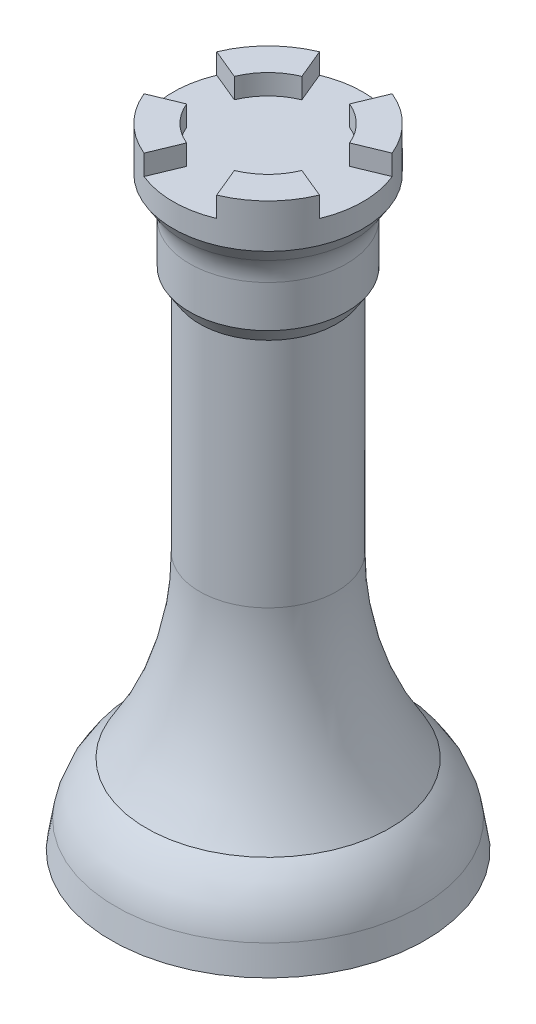
ISO-10303-21;
HEADER;
FILE_DESCRIPTION(('STEP AP214'),'2;1');
FILE_NAME('part.step','',(''),(''),'','','');
FILE_SCHEMA(('AUTOMOTIVE_DESIGN { 1 0 10303 214 1 1 1 1 }'));
ENDSEC;
DATA;
#1=APPLICATION_CONTEXT('core data for automotive mechanical design processes');
#2=APPLICATION_PROTOCOL_DEFINITION('international standard','automotive_design',2000,#1);
#3=PRODUCT_CONTEXT('',#1,'mechanical');
#4=PRODUCT('Part','Part','',(#3));
#5=PRODUCT_RELATED_PRODUCT_CATEGORY('part','',(#4));
#6=PRODUCT_DEFINITION_FORMATION('','',#4);
#7=PRODUCT_DEFINITION_CONTEXT('part definition',#1,'design');
#8=PRODUCT_DEFINITION('design','',#6,#7);
#9=PRODUCT_DEFINITION_SHAPE('','',#8);
#10=(LENGTH_UNIT() NAMED_UNIT(*) SI_UNIT(.MILLI.,.METRE.));
#11=(NAMED_UNIT(*) PLANE_ANGLE_UNIT() SI_UNIT($,.RADIAN.));
#12=(NAMED_UNIT(*) SI_UNIT($,.STERADIAN.) SOLID_ANGLE_UNIT());
#13=UNCERTAINTY_MEASURE_WITH_UNIT(LENGTH_MEASURE(1.E-05),#10,'distance_accuracy_value','');
#14=(GEOMETRIC_REPRESENTATION_CONTEXT(3) GLOBAL_UNCERTAINTY_ASSIGNED_CONTEXT((#13)) GLOBAL_UNIT_ASSIGNED_CONTEXT((#10,
#11,#12)) REPRESENTATION_CONTEXT('',''));
#15=CARTESIAN_POINT('',(0.,0.,0.));
#16=DIRECTION('',(0.,0.,1.));
#17=DIRECTION('',(1.,0.,0.));
#18=AXIS2_PLACEMENT_3D('',#15,#16,#17);
#19=CARTESIAN_POINT('',(4.58968126180055,-9.28491778158869,0.));
#20=DIRECTION('',(0.,-1.,0.));
#21=DIRECTION('',(0.,0.,-1.));
#22=AXIS2_PLACEMENT_3D('',#19,#20,#21);
#23=CYLINDRICAL_SURFACE('',#22,4.60999999999999);
#24=DIRECTION('',(0.,1.,0.));
#25=VECTOR('',#24,1.);
#26=CARTESIAN_POINT('',(2.82551063859744,0.,4.259084644877));
#27=LINE('',#26,#25);
#28=CARTESIAN_POINT('',(2.82551063859744,35.7150822184113,4.259084644877));
#29=VERTEX_POINT('',#28);
#30=CARTESIAN_POINT('',(2.82551063859744,37.2150822184113,4.259084644877));
#31=VERTEX_POINT('',#30);
#32=EDGE_CURVE('E159',#29,#31,#27,.T.);
#33=ORIENTED_EDGE('',*,*,#32,.F.);
#34=CARTESIAN_POINT('',(4.58968126180055,35.7150822184113,0.));
#35=DIRECTION('',(0.,-1.,0.));
#36=DIRECTION('',(0.,0.,-1.));
#37=AXIS2_PLACEMENT_3D('',#34,#35,#36);
#38=CIRCLE('',#37,4.60999999999999);
#39=CARTESIAN_POINT('',(0.330596616923532,35.7150822184113,1.76417062320306));
#40=VERTEX_POINT('',#39);
#41=EDGE_CURVE('E171',#29,#40,#38,.T.);
#42=ORIENTED_EDGE('',*,*,#41,.T.);
#43=DIRECTION('',(0.,1.,0.));
#44=VECTOR('',#43,1.);
#45=CARTESIAN_POINT('',(0.330596616923532,0.,1.76417062320306));
#46=LINE('',#45,#44);
#47=CARTESIAN_POINT('',(0.330596616923532,37.2150822184113,1.76417062320306));
#48=VERTEX_POINT('',#47);
#49=EDGE_CURVE('E256',#40,#48,#46,.T.);
#50=ORIENTED_EDGE('',*,*,#49,.T.);
#51=CARTESIAN_POINT('',(4.58968126180055,37.2150822184113,0.));
#52=DIRECTION('',(0.,-1.,0.));
#53=DIRECTION('',(0.,0.,-1.));
#54=AXIS2_PLACEMENT_3D('',#51,#52,#53);
#55=CIRCLE('',#54,4.60999999999999);
#56=EDGE_CURVE('E173',#31,#48,#55,.T.);
#57=ORIENTED_EDGE('',*,*,#56,.F.);
#58=EDGE_LOOP('',(#33,#42,#50,#57));
#59=FACE_BOUND('',#58,.T.);
#60=ADVANCED_FACE('F42',(#59),#23,.F.);
#61=CARTESIAN_POINT('',(0.,37.2150822184113,0.));
#62=DIRECTION('',(0.,-1.,0.));
#63=DIRECTION('',(0.,0.,-1.));
#64=AXIS2_PLACEMENT_3D('',#61,#62,#63);
#65=PLANE('',#64);
#66=DIRECTION('',(-0.3826834323651,0.,0.923879532511283));
#67=VECTOR('',#66,1.);
#68=CARTESIAN_POINT('',(2.83328628307293,37.2150822184113,4.24031257852809));
#69=LINE('',#68,#67);
#70=CARTESIAN_POINT('',(1.90324356659755,37.2150822184113,6.48563431822919));
#71=VERTEX_POINT('',#70);
#72=EDGE_CURVE('E174',#31,#71,#69,.T.);
#73=ORIENTED_EDGE('',*,*,#72,.F.);
#74=ORIENTED_EDGE('',*,*,#56,.T.);
#75=DIRECTION('',(-0.923879532511287,0.,0.382683432365091));
#76=VECTOR('',#75,1.);
#77=CARTESIAN_POINT('',(0.349368683272445,37.2150822184113,1.75639497872758));
#78=LINE('',#77,#76);
#79=CARTESIAN_POINT('',(-1.89595305642867,37.2150822184113,2.68643769520293));
#80=VERTEX_POINT('',#79);
#81=EDGE_CURVE('E258',#48,#80,#78,.T.);
#82=ORIENTED_EDGE('',*,*,#81,.T.);
#83=CARTESIAN_POINT('',(4.58968126180055,37.2150822184113,0.));
#84=DIRECTION('',(0.,-1.,0.));
#85=DIRECTION('',(0.,0.,-1.));
#86=AXIS2_PLACEMENT_3D('',#83,#84,#85);
#87=CIRCLE('',#86,7.01999999999999);
#88=EDGE_CURVE('E267',#71,#80,#87,.T.);
#89=ORIENTED_EDGE('',*,*,#88,.F.);
#90=EDGE_LOOP('',(#73,#74,#82,#89));
#91=FACE_BOUND('',#90,.T.);
#92=ADVANCED_FACE('F366',(#91),#65,.F.);
#93=CARTESIAN_POINT('',(8.84876590667757,35.7150822184113,1.76417062320306));
#94=VERTEX_POINT('',#93);
#95=CARTESIAN_POINT('',(6.35385188500357,35.7150822184113,4.25908464487704));
#96=VERTEX_POINT('',#95);
#97=EDGE_CURVE('E181',#94,#96,#38,.T.);
#98=ORIENTED_EDGE('',*,*,#97,.T.);
#99=DIRECTION('',(0.,1.,0.));
#100=VECTOR('',#99,1.);
#101=CARTESIAN_POINT('',(6.35385188500357,0.,4.25908464487704));
#102=LINE('',#101,#100);
#103=CARTESIAN_POINT('',(6.35385188500357,37.2150822184113,4.25908464487704));
#104=VERTEX_POINT('',#103);
#105=EDGE_CURVE('E57',#96,#104,#102,.T.);
#106=ORIENTED_EDGE('',*,*,#105,.T.);
#107=CARTESIAN_POINT('',(8.84876590667757,37.2150822184113,1.76417062320306));
#108=VERTEX_POINT('',#107);
#109=EDGE_CURVE('E274',#108,#104,#55,.T.);
#110=ORIENTED_EDGE('',*,*,#109,.F.);
#111=DIRECTION('',(0.,1.,0.));
#112=VECTOR('',#111,1.);
#113=CARTESIAN_POINT('',(8.84876590667757,0.,1.76417062320306));
#114=LINE('',#113,#112);
#115=EDGE_CURVE('E301',#94,#108,#114,.T.);
#116=ORIENTED_EDGE('',*,*,#115,.F.);
#117=EDGE_LOOP('',(#98,#106,#110,#116));
#118=FACE_BOUND('',#117,.T.);
#119=ADVANCED_FACE('F307',(#118),#23,.F.);
#120=ORIENTED_EDGE('',*,*,#109,.T.);
#121=DIRECTION('',(0.382683432365081,0.,0.923879532511291));
#122=VECTOR('',#121,1.);
#123=CARTESIAN_POINT('',(6.34607624052808,37.2150822184113,4.24031257852813));
#124=LINE('',#123,#122);
#125=CARTESIAN_POINT('',(7.27611895700342,37.2150822184113,6.48563431822925));
#126=VERTEX_POINT('',#125);
#127=EDGE_CURVE('E290',#104,#126,#124,.T.);
#128=ORIENTED_EDGE('',*,*,#127,.T.);
#129=CARTESIAN_POINT('',(11.0753155800298,37.2150822184113,2.68643769520293));
#130=VERTEX_POINT('',#129);
#131=EDGE_CURVE('E276',#130,#126,#87,.T.);
#132=ORIENTED_EDGE('',*,*,#131,.F.);
#133=DIRECTION('',(0.923879532511287,0.,0.382683432365091));
#134=VECTOR('',#133,1.);
#135=CARTESIAN_POINT('',(8.82999384032866,37.2150822184113,1.75639497872758));
#136=LINE('',#135,#134);
#137=EDGE_CURVE('E217',#108,#130,#136,.T.);
#138=ORIENTED_EDGE('',*,*,#137,.F.);
#139=EDGE_LOOP('',(#120,#128,#132,#138));
#140=FACE_BOUND('',#139,.T.);
#141=ADVANCED_FACE('F288',(#140),#65,.F.);
#142=CARTESIAN_POINT('',(6.35385188500363,35.7150822184113,-4.25908464487701));
#143=VERTEX_POINT('',#142);
#144=CARTESIAN_POINT('',(8.84876590667757,35.7150822184113,-1.76417062320306));
#145=VERTEX_POINT('',#144);
#146=EDGE_CURVE('E186',#143,#145,#38,.T.);
#147=ORIENTED_EDGE('',*,*,#146,.T.);
#148=DIRECTION('',(0.,1.,0.));
#149=VECTOR('',#148,1.);
#150=CARTESIAN_POINT('',(8.84876590667757,0.,-1.76417062320306));
#151=LINE('',#150,#149);
#152=CARTESIAN_POINT('',(8.84876590667757,37.2150822184113,-1.76417062320306));
#153=VERTEX_POINT('',#152);
#154=EDGE_CURVE('E65',#145,#153,#151,.T.);
#155=ORIENTED_EDGE('',*,*,#154,.T.);
#156=CARTESIAN_POINT('',(6.35385188500363,37.2150822184113,-4.25908464487701));
#157=VERTEX_POINT('',#156);
#158=EDGE_CURVE('E188',#157,#153,#55,.T.);
#159=ORIENTED_EDGE('',*,*,#158,.F.);
#160=DIRECTION('',(0.,1.,0.));
#161=VECTOR('',#160,1.);
#162=CARTESIAN_POINT('',(6.35385188500363,0.,-4.25908464487701));
#163=LINE('',#162,#161);
#164=EDGE_CURVE('E205',#143,#157,#163,.T.);
#165=ORIENTED_EDGE('',*,*,#164,.F.);
#166=EDGE_LOOP('',(#147,#155,#159,#165));
#167=FACE_BOUND('',#166,.T.);
#168=ADVANCED_FACE('F202',(#167),#23,.F.);
#169=ORIENTED_EDGE('',*,*,#158,.T.);
#170=DIRECTION('',(0.923879532511287,0.,-0.382683432365091));
#171=VECTOR('',#170,1.);
#172=CARTESIAN_POINT('',(8.82999384032866,37.2150822184113,-1.75639497872758));
#173=LINE('',#172,#171);
#174=CARTESIAN_POINT('',(11.0753155800298,37.2150822184113,-2.68643769520293));
#175=VERTEX_POINT('',#174);
#176=EDGE_CURVE('E214',#153,#175,#173,.T.);
#177=ORIENTED_EDGE('',*,*,#176,.T.);
#178=CARTESIAN_POINT('',(7.27611895700351,37.2150822184113,-6.48563431822921));
#179=VERTEX_POINT('',#178);
#180=EDGE_CURVE('E270',#179,#175,#87,.T.);
#181=ORIENTED_EDGE('',*,*,#180,.F.);
#182=DIRECTION('',(0.382683432365094,0.,-0.923879532511285));
#183=VECTOR('',#182,1.);
#184=CARTESIAN_POINT('',(6.34607624052814,37.2150822184113,-4.2403125785281));
#185=LINE('',#184,#183);
#186=EDGE_CURVE('E228',#157,#179,#185,.T.);
#187=ORIENTED_EDGE('',*,*,#186,.F.);
#188=EDGE_LOOP('',(#169,#177,#181,#187));
#189=FACE_BOUND('',#188,.T.);
#190=ADVANCED_FACE('F367',(#189),#65,.F.);
#191=CARTESIAN_POINT('',(4.58968126180055,-9.28491778158869,0.));
#192=DIRECTION('',(0.,-1.,0.));
#193=DIRECTION('',(0.,0.,-1.));
#194=AXIS2_PLACEMENT_3D('',#191,#192,#193);
#195=CYLINDRICAL_SURFACE('',#194,7.01999999999999);
#196=CARTESIAN_POINT('',(4.58968126180055,33.9850822184113,0.));
#197=DIRECTION('',(0.,-1.,0.));
#198=DIRECTION('',(0.,0.,-1.));
#199=AXIS2_PLACEMENT_3D('',#196,#197,#198);
#200=CIRCLE('',#199,7.01999999999998);
#201=CARTESIAN_POINT('',(4.58968126180055,33.9850822184113,-7.01999999999998));
#202=VERTEX_POINT('',#201);
#203=EDGE_CURVE('E11',#202,#202,#200,.T.);
#204=ORIENTED_EDGE('',*,*,#203,.F.);
#205=EDGE_LOOP('',(#204));
#206=FACE_BOUND('',#205,.T.);
#207=ORIENTED_EDGE('',*,*,#131,.T.);
#208=DIRECTION('',(0.,-1.,0.));
#209=VECTOR('',#208,1.);
#210=CARTESIAN_POINT('',(7.27611895700342,0.,6.48563431822926));
#211=LINE('',#210,#209);
#212=CARTESIAN_POINT('',(7.27611895700342,35.7150822184113,6.48563431822925));
#213=VERTEX_POINT('',#212);
#214=EDGE_CURVE('E283',#126,#213,#211,.T.);
#215=ORIENTED_EDGE('',*,*,#214,.T.);
#216=CARTESIAN_POINT('',(4.58968126180055,35.7150822184113,0.));
#217=DIRECTION('',(0.,-1.,0.));
#218=DIRECTION('',(-1.,0.,0.));
#219=AXIS2_PLACEMENT_3D('',#216,#217,#218);
#220=CIRCLE('',#219,7.01999999999999);
#221=CARTESIAN_POINT('',(1.90324356659755,35.7150822184113,6.48563431822919));
#222=VERTEX_POINT('',#221);
#223=EDGE_CURVE('E292',#213,#222,#220,.T.);
#224=ORIENTED_EDGE('',*,*,#223,.T.);
#225=DIRECTION('',(0.,-1.,0.));
#226=VECTOR('',#225,1.);
#227=CARTESIAN_POINT('',(1.90324356659755,0.,6.4856343182292));
#228=LINE('',#227,#226);
#229=EDGE_CURVE('E162',#71,#222,#228,.T.);
#230=ORIENTED_EDGE('',*,*,#229,.F.);
#231=ORIENTED_EDGE('',*,*,#88,.T.);
#232=DIRECTION('',(0.,-1.,0.));
#233=VECTOR('',#232,1.);
#234=CARTESIAN_POINT('',(-1.89595305642868,0.,2.68643769520294));
#235=LINE('',#234,#233);
#236=CARTESIAN_POINT('',(-1.89595305642867,35.7150822184113,2.68643769520293));
#237=VERTEX_POINT('',#236);
#238=EDGE_CURVE('E261',#80,#237,#235,.T.);
#239=ORIENTED_EDGE('',*,*,#238,.T.);
#240=CARTESIAN_POINT('',(4.58968126180055,35.7150822184113,0.));
#241=DIRECTION('',(0.,-1.,0.));
#242=DIRECTION('',(0.,0.,-1.));
#243=AXIS2_PLACEMENT_3D('',#240,#241,#242);
#244=CIRCLE('',#243,7.01999999999999);
#245=CARTESIAN_POINT('',(-1.89595305642867,35.7150822184113,-2.68643769520293));
#246=VERTEX_POINT('',#245);
#247=EDGE_CURVE('E264',#237,#246,#244,.T.);
#248=ORIENTED_EDGE('',*,*,#247,.T.);
#249=DIRECTION('',(0.,-1.,0.));
#250=VECTOR('',#249,1.);
#251=CARTESIAN_POINT('',(-1.89595305642868,0.,-2.68643769520294));
#252=LINE('',#251,#250);
#253=CARTESIAN_POINT('',(-1.89595305642867,37.2150822184113,-2.68643769520293));
#254=VERTEX_POINT('',#253);
#255=EDGE_CURVE('E252',#254,#246,#252,.T.);
#256=ORIENTED_EDGE('',*,*,#255,.F.);
#257=CARTESIAN_POINT('',(1.90324356659764,37.2150822184113,-6.48563431822923));
#258=VERTEX_POINT('',#257);
#259=EDGE_CURVE('E268',#254,#258,#87,.T.);
#260=ORIENTED_EDGE('',*,*,#259,.T.);
#261=DIRECTION('',(0.,-1.,0.));
#262=VECTOR('',#261,1.);
#263=CARTESIAN_POINT('',(1.90324356659764,0.,-6.48563431822924));
#264=LINE('',#263,#262);
#265=CARTESIAN_POINT('',(1.90324356659764,35.7150822184113,-6.48563431822923));
#266=VERTEX_POINT('',#265);
#267=EDGE_CURVE('E240',#258,#266,#264,.T.);
#268=ORIENTED_EDGE('',*,*,#267,.T.);
#269=CARTESIAN_POINT('',(4.58968126180055,35.7150822184113,0.));
#270=DIRECTION('',(0.,-1.,0.));
#271=DIRECTION('',(1.,0.,0.));
#272=AXIS2_PLACEMENT_3D('',#269,#270,#271);
#273=CIRCLE('',#272,7.01999999999999);
#274=CARTESIAN_POINT('',(7.27611895700351,35.7150822184113,-6.48563431822921));
#275=VERTEX_POINT('',#274);
#276=EDGE_CURVE('E243',#266,#275,#273,.T.);
#277=ORIENTED_EDGE('',*,*,#276,.T.);
#278=DIRECTION('',(0.,-1.,0.));
#279=VECTOR('',#278,1.);
#280=CARTESIAN_POINT('',(7.27611895700351,0.,-6.48563431822922));
#281=LINE('',#280,#279);
#282=EDGE_CURVE('E230',#179,#275,#281,.T.);
#283=ORIENTED_EDGE('',*,*,#282,.F.);
#284=ORIENTED_EDGE('',*,*,#180,.T.);
#285=DIRECTION('',(0.,-1.,0.));
#286=VECTOR('',#285,1.);
#287=CARTESIAN_POINT('',(11.0753155800298,0.,-2.68643769520294));
#288=LINE('',#287,#286);
#289=CARTESIAN_POINT('',(11.0753155800298,35.7150822184113,-2.68643769520293));
#290=VERTEX_POINT('',#289);
#291=EDGE_CURVE('E223',#175,#290,#288,.T.);
#292=ORIENTED_EDGE('',*,*,#291,.T.);
#293=CARTESIAN_POINT('',(4.58968126180055,35.7150822184113,0.));
#294=DIRECTION('',(0.,-1.,0.));
#295=DIRECTION('',(0.,0.,1.));
#296=AXIS2_PLACEMENT_3D('',#293,#294,#295);
#297=CIRCLE('',#296,7.01999999999999);
#298=CARTESIAN_POINT('',(11.0753155800298,35.7150822184113,2.68643769520293));
#299=VERTEX_POINT('',#298);
#300=EDGE_CURVE('E210',#290,#299,#297,.T.);
#301=ORIENTED_EDGE('',*,*,#300,.T.);
#302=DIRECTION('',(0.,-1.,0.));
#303=VECTOR('',#302,1.);
#304=CARTESIAN_POINT('',(11.0753155800298,0.,2.68643769520294));
#305=LINE('',#304,#303);
#306=EDGE_CURVE('E212',#130,#299,#305,.T.);
#307=ORIENTED_EDGE('',*,*,#306,.F.);
#308=EDGE_LOOP('',(#207,#215,#224,#230,#231,#239,#248,#256,#260,#268,#277,#283,#284,#292,#301,#307));
#309=FACE_BOUND('',#308,.T.);
#310=ADVANCED_FACE('F44',(#206,#309),#195,.T.);
#311=CARTESIAN_POINT('',(4.58968126180055,33.9850822184113,0.));
#312=DIRECTION('',(0.,1.,0.));
#313=DIRECTION('',(0.,0.,1.));
#314=AXIS2_PLACEMENT_3D('',#311,#312,#313);
#315=CONICAL_SURFACE('',#314,7.01999999999998,0.574227335637157);
#316=CARTESIAN_POINT('',(4.58968126180055,32.910378533755,0.));
#317=DIRECTION('',(0.,-1.,0.));
#318=DIRECTION('',(0.,0.,-1.));
#319=AXIS2_PLACEMENT_3D('',#316,#317,#318);
#320=CIRCLE('',#319,6.32472164553591);
#321=CARTESIAN_POINT('',(4.58968126180055,32.910378533755,-6.32472164553591));
#322=VERTEX_POINT('',#321);
#323=EDGE_CURVE('E50',#322,#322,#320,.T.);
#324=ORIENTED_EDGE('',*,*,#323,.F.);
#325=EDGE_LOOP('',(#324));
#326=FACE_BOUND('',#325,.T.);
#327=ORIENTED_EDGE('',*,*,#203,.T.);
#328=EDGE_LOOP('',(#327));
#329=FACE_BOUND('',#328,.T.);
#330=ADVANCED_FACE('F402',(#326,#329),#315,.T.);
#331=CARTESIAN_POINT('',(4.58968126180055,31.1296536652647,0.));
#332=DIRECTION('',(0.,-1.,0.));
#333=DIRECTION('',(0.,0.,-1.));
#334=AXIS2_PLACEMENT_3D('',#331,#332,#333);
#335=TOROIDAL_SURFACE('',#334,9.07721863503418,3.27829540073147);
#336=CARTESIAN_POINT('',(4.58968126180055,31.1296536652647,0.));
#337=DIRECTION('',(0.,-1.,0.));
#338=DIRECTION('',(0.,0.,-1.));
#339=AXIS2_PLACEMENT_3D('',#336,#337,#338);
#340=CIRCLE('',#339,5.79892323430271);
#341=CARTESIAN_POINT('',(4.58968126180055,31.1296536652647,-5.79892323430271));
#342=VERTEX_POINT('',#341);
#343=EDGE_CURVE('E624',#342,#342,#340,.T.);
#344=ORIENTED_EDGE('',*,*,#343,.F.);
#345=EDGE_LOOP('',(#344));
#346=FACE_BOUND('',#345,.T.);
#347=ORIENTED_EDGE('',*,*,#323,.T.);
#348=EDGE_LOOP('',(#347));
#349=FACE_BOUND('',#348,.T.);
#350=ADVANCED_FACE('F399',(#346,#349),#335,.F.);
#351=CARTESIAN_POINT('',(4.58968126180055,-9.28491778158869,0.));
#352=DIRECTION('',(0.,-1.,0.));
#353=DIRECTION('',(0.,0.,-1.));
#354=AXIS2_PLACEMENT_3D('',#351,#352,#353);
#355=CYLINDRICAL_SURFACE('',#354,5.79892323430271);
#356=CARTESIAN_POINT('',(4.58968126180055,28.0477884174672,0.));
#357=DIRECTION('',(0.,-1.,0.));
#358=DIRECTION('',(0.,0.,-1.));
#359=AXIS2_PLACEMENT_3D('',#356,#357,#358);
#360=CIRCLE('',#359,5.79892323430272);
#361=CARTESIAN_POINT('',(4.58968126180055,28.0477884174672,-5.79892323430272));
#362=VERTEX_POINT('',#361);
#363=EDGE_CURVE('E626',#362,#362,#360,.T.);
#364=ORIENTED_EDGE('',*,*,#363,.F.);
#365=EDGE_LOOP('',(#364));
#366=FACE_BOUND('',#365,.T.);
#367=ORIENTED_EDGE('',*,*,#343,.T.);
#368=EDGE_LOOP('',(#367));
#369=FACE_BOUND('',#368,.T.);
#370=ADVANCED_FACE('F395',(#366,#369),#355,.T.);
#371=CARTESIAN_POINT('',(4.58968126180055,28.0477884174672,0.));
#372=DIRECTION('',(0.,1.,0.));
#373=DIRECTION('',(0.,0.,1.));
#374=AXIS2_PLACEMENT_3D('',#371,#372,#373);
#375=CONICAL_SURFACE('',#374,5.79892323430272,0.57422733563716);
#376=CARTESIAN_POINT('',(4.58968126180055,26.9092337454564,0.));
#377=DIRECTION('',(0.,-1.,0.));
#378=DIRECTION('',(0.,0.,-1.));
#379=AXIS2_PLACEMENT_3D('',#376,#377,#378);
#380=CIRCLE('',#379,5.06233655452755);
#381=CARTESIAN_POINT('',(4.58968126180055,26.9092337454564,-5.06233655452755));
#382=VERTEX_POINT('',#381);
#383=EDGE_CURVE('E631',#382,#382,#380,.T.);
#384=ORIENTED_EDGE('',*,*,#383,.F.);
#385=EDGE_LOOP('',(#384));
#386=FACE_BOUND('',#385,.T.);
#387=ORIENTED_EDGE('',*,*,#363,.T.);
#388=EDGE_LOOP('',(#387));
#389=FACE_BOUND('',#388,.T.);
#390=ADVANCED_FACE('F391',(#386,#389),#375,.T.);
#391=CARTESIAN_POINT('',(4.58968126180055,-9.28491778158869,0.));
#392=DIRECTION('',(0.,-1.,0.));
#393=DIRECTION('',(0.,0.,-1.));
#394=AXIS2_PLACEMENT_3D('',#391,#392,#393);
#395=CYLINDRICAL_SURFACE('',#394,5.06233655452755);
#396=CARTESIAN_POINT('',(4.58968126180055,9.77886362689687,0.));
#397=DIRECTION('',(0.,-1.,0.));
#398=DIRECTION('',(0.,0.,-1.));
#399=AXIS2_PLACEMENT_3D('',#396,#397,#398);
#400=CIRCLE('',#399,5.06233655452755);
#401=CARTESIAN_POINT('',(4.58968126180055,9.77886362689687,-5.06233655452755));
#402=VERTEX_POINT('',#401);
#403=EDGE_CURVE('E634',#402,#402,#400,.T.);
#404=ORIENTED_EDGE('',*,*,#403,.F.);
#405=EDGE_LOOP('',(#404));
#406=FACE_BOUND('',#405,.T.);
#407=ORIENTED_EDGE('',*,*,#383,.T.);
#408=EDGE_LOOP('',(#407));
#409=FACE_BOUND('',#408,.T.);
#410=ADVANCED_FACE('F387',(#406,#409),#395,.T.);
#411=CARTESIAN_POINT('',(4.58968126180055,9.77886362689687,0.));
#412=DIRECTION('',(0.,-1.,0.));
#413=DIRECTION('',(0.,0.,-1.));
#414=AXIS2_PLACEMENT_3D('',#411,#412,#413);
#415=TOROIDAL_SURFACE('',#414,29.0889702478411,24.0266336933136);
#416=CARTESIAN_POINT('',(4.58968126180055,-3.40113641157146,0.));
#417=DIRECTION('',(0.,-1.,0.));
#418=DIRECTION('',(0.,0.,-1.));
#419=AXIS2_PLACEMENT_3D('',#416,#417,#418);
#420=CIRCLE('',#419,9.);
#421=CARTESIAN_POINT('',(4.58968126180055,-3.40113641157146,-9.));
#422=VERTEX_POINT('',#421);
#423=EDGE_CURVE('E637',#422,#422,#420,.T.);
#424=ORIENTED_EDGE('',*,*,#423,.F.);
#425=EDGE_LOOP('',(#424));
#426=FACE_BOUND('',#425,.T.);
#427=ORIENTED_EDGE('',*,*,#403,.T.);
#428=EDGE_LOOP('',(#427));
#429=FACE_BOUND('',#428,.T.);
#430=ADVANCED_FACE('F383',(#426,#429),#415,.F.);
#431=CARTESIAN_POINT('',(4.58968126180055,-8.3205370558314,0.));
#432=DIRECTION('',(0.,-1.,0.));
#433=DIRECTION('',(0.,0.,-1.));
#434=AXIS2_PLACEMENT_3D('',#431,#432,#433);
#435=DEGENERATE_TOROIDAL_SURFACE('',#434,5.03444467813825,6.31871282062187,.T.);
#436=CARTESIAN_POINT('',(4.58968126180055,-7.28491778158869,0.));
#437=DIRECTION('',(0.,-1.,0.));
#438=DIRECTION('',(0.,0.,-1.));
#439=AXIS2_PLACEMENT_3D('',#436,#437,#438);
#440=CIRCLE('',#439,11.2677122344291);
#441=CARTESIAN_POINT('',(4.58968126180055,-7.28491778158869,-11.2677122344291));
#442=VERTEX_POINT('',#441);
#443=EDGE_CURVE('E197',#442,#442,#440,.T.);
#444=ORIENTED_EDGE('',*,*,#443,.F.);
#445=EDGE_LOOP('',(#444));
#446=FACE_BOUND('',#445,.T.);
#447=ORIENTED_EDGE('',*,*,#423,.T.);
#448=EDGE_LOOP('',(#447));
#449=FACE_BOUND('',#448,.T.);
#450=ADVANCED_FACE('F379',(#446,#449),#435,.T.);
#451=CARTESIAN_POINT('',(4.58968126180055,-7.28491778158869,0.));
#452=DIRECTION('',(0.,-1.,0.));
#453=DIRECTION('',(0.,0.,-1.));
#454=AXIS2_PLACEMENT_3D('',#451,#452,#453);
#455=CONICAL_SURFACE('',#454,11.2677122344291,0.164639979746133);
#456=CARTESIAN_POINT('',(4.58968126180055,-9.28491778158869,0.));
#457=DIRECTION('',(0.,-1.,0.));
#458=DIRECTION('',(0.,0.,-1.));
#459=AXIS2_PLACEMENT_3D('',#456,#457,#458);
#460=CIRCLE('',#459,11.6);
#461=CARTESIAN_POINT('',(4.58968126180055,-9.28491778158869,-11.6));
#462=VERTEX_POINT('',#461);
#463=EDGE_CURVE('E192',#462,#462,#460,.T.);
#464=ORIENTED_EDGE('',*,*,#463,.F.);
#465=EDGE_LOOP('',(#464));
#466=FACE_BOUND('',#465,.T.);
#467=ORIENTED_EDGE('',*,*,#443,.T.);
#468=EDGE_LOOP('',(#467));
#469=FACE_BOUND('',#468,.T.);
#470=ADVANCED_FACE('F375',(#466,#469),#455,.T.);
#471=CARTESIAN_POINT('',(0.,-9.28491778158869,0.));
#472=DIRECTION('',(0.,-1.,0.));
#473=DIRECTION('',(0.,0.,-1.));
#474=AXIS2_PLACEMENT_3D('',#471,#472,#473);
#475=PLANE('',#474);
#476=ORIENTED_EDGE('',*,*,#463,.T.);
#477=EDGE_LOOP('',(#476));
#478=FACE_BOUND('',#477,.T.);
#479=ADVANCED_FACE('F372',(#478),#475,.T.);
#480=CARTESIAN_POINT('',(0.,35.7150822184113,0.));
#481=DIRECTION('',(0.,1.,0.));
#482=DIRECTION('',(0.,0.,1.));
#483=AXIS2_PLACEMENT_3D('',#480,#481,#482);
#484=PLANE('',#483);
#485=CARTESIAN_POINT('',(0.330596616923532,35.7150822184113,-1.76417062320306));
#486=VERTEX_POINT('',#485);
#487=CARTESIAN_POINT('',(2.8255106385975,35.7150822184113,-4.25908464487703));
#488=VERTEX_POINT('',#487);
#489=EDGE_CURVE('E184',#486,#488,#38,.T.);
#490=ORIENTED_EDGE('',*,*,#489,.F.);
#491=DIRECTION('',(-0.923879532511287,0.,-0.382683432365091));
#492=VECTOR('',#491,1.);
#493=CARTESIAN_POINT('',(0.349368683272446,35.7150822184113,-1.75639497872758));
#494=LINE('',#493,#492);
#495=EDGE_CURVE('E246',#486,#246,#494,.T.);
#496=ORIENTED_EDGE('',*,*,#495,.T.);
#497=ORIENTED_EDGE('',*,*,#247,.F.);
#498=DIRECTION('',(-0.923879532511287,0.,0.382683432365091));
#499=VECTOR('',#498,1.);
#500=CARTESIAN_POINT('',(0.349368683272445,35.7150822184113,1.75639497872758));
#501=LINE('',#500,#499);
#502=EDGE_CURVE('E179',#40,#237,#501,.T.);
#503=ORIENTED_EDGE('',*,*,#502,.F.);
#504=ORIENTED_EDGE('',*,*,#41,.F.);
#505=DIRECTION('',(-0.3826834323651,0.,0.923879532511283));
#506=VECTOR('',#505,1.);
#507=CARTESIAN_POINT('',(2.83328628307293,35.7150822184113,4.24031257852809));
#508=LINE('',#507,#506);
#509=EDGE_CURVE('E156',#29,#222,#508,.T.);
#510=ORIENTED_EDGE('',*,*,#509,.T.);
#511=ORIENTED_EDGE('',*,*,#223,.F.);
#512=DIRECTION('',(0.382683432365081,0.,0.923879532511291));
#513=VECTOR('',#512,1.);
#514=CARTESIAN_POINT('',(6.34607624052808,35.7150822184113,4.24031257852813));
#515=LINE('',#514,#513);
#516=EDGE_CURVE('E294',#96,#213,#515,.T.);
#517=ORIENTED_EDGE('',*,*,#516,.F.);
#518=ORIENTED_EDGE('',*,*,#97,.F.);
#519=DIRECTION('',(0.923879532511287,0.,0.382683432365091));
#520=VECTOR('',#519,1.);
#521=CARTESIAN_POINT('',(8.82999384032866,35.7150822184113,1.75639497872758));
#522=LINE('',#521,#520);
#523=EDGE_CURVE('E299',#94,#299,#522,.T.);
#524=ORIENTED_EDGE('',*,*,#523,.T.);
#525=ORIENTED_EDGE('',*,*,#300,.F.);
#526=DIRECTION('',(0.923879532511287,0.,-0.382683432365091));
#527=VECTOR('',#526,1.);
#528=CARTESIAN_POINT('',(8.82999384032866,35.7150822184113,-1.75639497872758));
#529=LINE('',#528,#527);
#530=EDGE_CURVE('E208',#145,#290,#529,.T.);
#531=ORIENTED_EDGE('',*,*,#530,.F.);
#532=ORIENTED_EDGE('',*,*,#146,.F.);
#533=DIRECTION('',(0.382683432365094,0.,-0.923879532511285));
#534=VECTOR('',#533,1.);
#535=CARTESIAN_POINT('',(6.34607624052814,35.7150822184113,-4.2403125785281));
#536=LINE('',#535,#534);
#537=EDGE_CURVE('E206',#143,#275,#536,.T.);
#538=ORIENTED_EDGE('',*,*,#537,.T.);
#539=ORIENTED_EDGE('',*,*,#276,.F.);
#540=DIRECTION('',(-0.382683432365088,0.,-0.923879532511288));
#541=VECTOR('',#540,1.);
#542=CARTESIAN_POINT('',(2.83328628307299,35.7150822184113,-4.24031257852811));
#543=LINE('',#542,#541);
#544=EDGE_CURVE('E232',#488,#266,#543,.T.);
#545=ORIENTED_EDGE('',*,*,#544,.F.);
#546=EDGE_LOOP('',(#490,#496,#497,#503,#504,#510,#511,#517,#518,#524,#525,#531,#532,#538,#539,#545));
#547=FACE_BOUND('',#546,.T.);
#548=ADVANCED_FACE('F177',(#547),#484,.T.);
#549=ORIENTED_EDGE('',*,*,#489,.T.);
#550=DIRECTION('',(0.,1.,0.));
#551=VECTOR('',#550,1.);
#552=CARTESIAN_POINT('',(2.8255106385975,0.,-4.25908464487703));
#553=LINE('',#552,#551);
#554=CARTESIAN_POINT('',(2.8255106385975,37.2150822184113,-4.25908464487703));
#555=VERTEX_POINT('',#554);
#556=EDGE_CURVE('E235',#488,#555,#553,.T.);
#557=ORIENTED_EDGE('',*,*,#556,.T.);
#558=CARTESIAN_POINT('',(0.330596616923533,37.2150822184113,-1.76417062320306));
#559=VERTEX_POINT('',#558);
#560=EDGE_CURVE('E182',#559,#555,#55,.T.);
#561=ORIENTED_EDGE('',*,*,#560,.F.);
#562=DIRECTION('',(0.,1.,0.));
#563=VECTOR('',#562,1.);
#564=CARTESIAN_POINT('',(0.330596616923532,0.,-1.76417062320306));
#565=LINE('',#564,#563);
#566=EDGE_CURVE('E248',#486,#559,#565,.T.);
#567=ORIENTED_EDGE('',*,*,#566,.F.);
#568=EDGE_LOOP('',(#549,#557,#561,#567));
#569=FACE_BOUND('',#568,.T.);
#570=ADVANCED_FACE('F364',(#569),#23,.F.);
#571=ORIENTED_EDGE('',*,*,#560,.T.);
#572=DIRECTION('',(-0.382683432365088,0.,-0.923879532511288));
#573=VECTOR('',#572,1.);
#574=CARTESIAN_POINT('',(2.83328628307299,37.2150822184113,-4.24031257852811));
#575=LINE('',#574,#573);
#576=EDGE_CURVE('E237',#555,#258,#575,.T.);
#577=ORIENTED_EDGE('',*,*,#576,.T.);
#578=ORIENTED_EDGE('',*,*,#259,.F.);
#579=DIRECTION('',(-0.923879532511287,0.,-0.382683432365091));
#580=VECTOR('',#579,1.);
#581=CARTESIAN_POINT('',(0.349368683272446,37.2150822184113,-1.75639497872758));
#582=LINE('',#581,#580);
#583=EDGE_CURVE('E250',#559,#254,#582,.T.);
#584=ORIENTED_EDGE('',*,*,#583,.F.);
#585=EDGE_LOOP('',(#571,#577,#578,#584));
#586=FACE_BOUND('',#585,.T.);
#587=ADVANCED_FACE('F360',(#586),#65,.F.);
#588=CARTESIAN_POINT('',(0.349368683272445,0.,1.75639497872758));
#589=DIRECTION('',(0.382683432365091,0.,0.923879532511287));
#590=DIRECTION('',(0.923879532511287,0.,-0.382683432365091));
#591=AXIS2_PLACEMENT_3D('',#588,#589,#590);
#592=PLANE('',#591);
#593=ORIENTED_EDGE('',*,*,#502,.T.);
#594=ORIENTED_EDGE('',*,*,#238,.F.);
#595=ORIENTED_EDGE('',*,*,#81,.F.);
#596=ORIENTED_EDGE('',*,*,#49,.F.);
#597=EDGE_LOOP('',(#593,#594,#595,#596));
#598=FACE_BOUND('',#597,.T.);
#599=ADVANCED_FACE('F356',(#598),#592,.F.);
#600=CARTESIAN_POINT('',(0.349368683272446,0.,-1.75639497872758));
#601=DIRECTION('',(-0.382683432365091,0.,0.923879532511287));
#602=DIRECTION('',(0.923879532511287,0.,0.382683432365091));
#603=AXIS2_PLACEMENT_3D('',#600,#601,#602);
#604=PLANE('',#603);
#605=ORIENTED_EDGE('',*,*,#495,.F.);
#606=ORIENTED_EDGE('',*,*,#566,.T.);
#607=ORIENTED_EDGE('',*,*,#583,.T.);
#608=ORIENTED_EDGE('',*,*,#255,.T.);
#609=EDGE_LOOP('',(#605,#606,#607,#608));
#610=FACE_BOUND('',#609,.T.);
#611=ADVANCED_FACE('F352',(#610),#604,.T.);
#612=CARTESIAN_POINT('',(2.83328628307299,0.,-4.24031257852811));
#613=DIRECTION('',(-0.923879532511288,0.,0.382683432365088));
#614=DIRECTION('',(0.382683432365088,0.,0.923879532511288));
#615=AXIS2_PLACEMENT_3D('',#612,#613,#614);
#616=PLANE('',#615);
#617=ORIENTED_EDGE('',*,*,#544,.T.);
#618=ORIENTED_EDGE('',*,*,#267,.F.);
#619=ORIENTED_EDGE('',*,*,#576,.F.);
#620=ORIENTED_EDGE('',*,*,#556,.F.);
#621=EDGE_LOOP('',(#617,#618,#619,#620));
#622=FACE_BOUND('',#621,.T.);
#623=ADVANCED_FACE('F348',(#622),#616,.F.);
#624=CARTESIAN_POINT('',(6.34607624052814,0.,-4.2403125785281));
#625=DIRECTION('',(-0.923879532511285,0.,-0.382683432365094));
#626=DIRECTION('',(-0.382683432365094,0.,0.923879532511285));
#627=AXIS2_PLACEMENT_3D('',#624,#625,#626);
#628=PLANE('',#627);
#629=ORIENTED_EDGE('',*,*,#537,.F.);
#630=ORIENTED_EDGE('',*,*,#164,.T.);
#631=ORIENTED_EDGE('',*,*,#186,.T.);
#632=ORIENTED_EDGE('',*,*,#282,.T.);
#633=EDGE_LOOP('',(#629,#630,#631,#632));
#634=FACE_BOUND('',#633,.T.);
#635=ADVANCED_FACE('F345',(#634),#628,.T.);
#636=CARTESIAN_POINT('',(8.82999384032866,0.,-1.75639497872758));
#637=DIRECTION('',(-0.382683432365091,0.,-0.923879532511287));
#638=DIRECTION('',(-0.923879532511287,0.,0.382683432365091));
#639=AXIS2_PLACEMENT_3D('',#636,#637,#638);
#640=PLANE('',#639);
#641=ORIENTED_EDGE('',*,*,#530,.T.);
#642=ORIENTED_EDGE('',*,*,#291,.F.);
#643=ORIENTED_EDGE('',*,*,#176,.F.);
#644=ORIENTED_EDGE('',*,*,#154,.F.);
#645=EDGE_LOOP('',(#641,#642,#643,#644));
#646=FACE_BOUND('',#645,.T.);
#647=ADVANCED_FACE('F342',(#646),#640,.F.);
#648=CARTESIAN_POINT('',(8.82999384032866,0.,1.75639497872758));
#649=DIRECTION('',(0.382683432365091,0.,-0.923879532511287));
#650=DIRECTION('',(-0.923879532511287,0.,-0.382683432365091));
#651=AXIS2_PLACEMENT_3D('',#648,#649,#650);
#652=PLANE('',#651);
#653=ORIENTED_EDGE('',*,*,#523,.F.);
#654=ORIENTED_EDGE('',*,*,#115,.T.);
#655=ORIENTED_EDGE('',*,*,#137,.T.);
#656=ORIENTED_EDGE('',*,*,#306,.T.);
#657=EDGE_LOOP('',(#653,#654,#655,#656));
#658=FACE_BOUND('',#657,.T.);
#659=ADVANCED_FACE('F303',(#658),#652,.T.);
#660=CARTESIAN_POINT('',(6.34607624052808,0.,4.24031257852813));
#661=DIRECTION('',(0.923879532511291,0.,-0.382683432365081));
#662=DIRECTION('',(-0.382683432365081,0.,-0.923879532511291));
#663=AXIS2_PLACEMENT_3D('',#660,#661,#662);
#664=PLANE('',#663);
#665=ORIENTED_EDGE('',*,*,#516,.T.);
#666=ORIENTED_EDGE('',*,*,#214,.F.);
#667=ORIENTED_EDGE('',*,*,#127,.F.);
#668=ORIENTED_EDGE('',*,*,#105,.F.);
#669=EDGE_LOOP('',(#665,#666,#667,#668));
#670=FACE_BOUND('',#669,.T.);
#671=ADVANCED_FACE('F337',(#670),#664,.F.);
#672=CARTESIAN_POINT('',(2.83328628307293,0.,4.24031257852809));
#673=DIRECTION('',(0.923879532511283,0.,0.3826834323651));
#674=DIRECTION('',(0.3826834323651,0.,-0.923879532511283));
#675=AXIS2_PLACEMENT_3D('',#672,#673,#674);
#676=PLANE('',#675);
#677=ORIENTED_EDGE('',*,*,#509,.F.);
#678=ORIENTED_EDGE('',*,*,#32,.T.);
#679=ORIENTED_EDGE('',*,*,#72,.T.);
#680=ORIENTED_EDGE('',*,*,#229,.T.);
#681=EDGE_LOOP('',(#677,#678,#679,#680));
#682=FACE_BOUND('',#681,.T.);
#683=ADVANCED_FACE('F158',(#682),#676,.T.);
#684=CLOSED_SHELL('',(#60,#92,#119,#141,#168,#190,#310,#330,#350,#370,#390,#410,#430,#450,#470,
#479,#548,#570,#587,#599,#611,#623,#635,#647,#659,#671,#683));
#685=CARTESIAN_POINT('',(4.58968126180055,-6.88491778158869,0.));
#686=DIRECTION('',(0.,-1.,0.));
#687=DIRECTION('',(0.,0.,-1.));
#688=AXIS2_PLACEMENT_3D('',#685,#686,#687);
#689=CYLINDRICAL_SURFACE('',#688,10.);
#690=CARTESIAN_POINT('',(4.58968126180055,-6.88491778158869,0.));
#691=DIRECTION('',(0.,-1.,0.));
#692=DIRECTION('',(0.,0.,-1.));
#693=AXIS2_PLACEMENT_3D('',#690,#691,#692);
#694=CIRCLE('',#693,10.);
#695=CARTESIAN_POINT('',(4.58968126180055,-6.88491778158869,-10.));
#696=VERTEX_POINT('',#695);
#697=EDGE_CURVE('E166',#696,#696,#694,.T.);
#698=ORIENTED_EDGE('',*,*,#697,.F.);
#699=EDGE_LOOP('',(#698));
#700=FACE_BOUND('',#699,.T.);
#701=CARTESIAN_POINT('',(4.58968126180055,-8.88491778158869,0.));
#702=DIRECTION('',(0.,-1.,0.));
#703=DIRECTION('',(0.,0.,-1.));
#704=AXIS2_PLACEMENT_3D('',#701,#702,#703);
#705=CIRCLE('',#704,10.);
#706=CARTESIAN_POINT('',(4.58968126180055,-8.88491778158869,-10.));
#707=VERTEX_POINT('',#706);
#708=EDGE_CURVE('E311',#707,#707,#705,.T.);
#709=ORIENTED_EDGE('',*,*,#708,.T.);
#710=EDGE_LOOP('',(#709));
#711=FACE_BOUND('',#710,.T.);
#712=ADVANCED_FACE('F319',(#700,#711),#689,.F.);
#713=CARTESIAN_POINT('',(4.58968126180055,-6.88491778158869,0.));
#714=DIRECTION('',(0.,-1.,0.));
#715=DIRECTION('',(0.,0.,-1.));
#716=AXIS2_PLACEMENT_3D('',#713,#714,#715);
#717=PLANE('',#716);
#718=ORIENTED_EDGE('',*,*,#697,.T.);
#719=EDGE_LOOP('',(#718));
#720=FACE_BOUND('',#719,.T.);
#721=ADVANCED_FACE('F317',(#720),#717,.T.);
#722=CARTESIAN_POINT('',(4.58968126180055,-8.88491778158869,0.));
#723=DIRECTION('',(0.,-1.,0.));
#724=DIRECTION('',(0.,0.,-1.));
#725=AXIS2_PLACEMENT_3D('',#722,#723,#724);
#726=PLANE('',#725);
#727=ORIENTED_EDGE('',*,*,#708,.F.);
#728=EDGE_LOOP('',(#727));
#729=FACE_BOUND('',#728,.T.);
#730=ADVANCED_FACE('F326',(#729),#726,.F.);
#731=CLOSED_SHELL('',(#712,#721,#730));
#732=ORIENTED_CLOSED_SHELL('',*,#731,.T.);
#733=BREP_WITH_VOIDS('B2',#684,(#732));
#734=ADVANCED_BREP_SHAPE_REPRESENTATION('',(#18,#733),#14);
#735=SHAPE_DEFINITION_REPRESENTATION(#9,#734);
ENDSEC;
END-ISO-10303-21;
